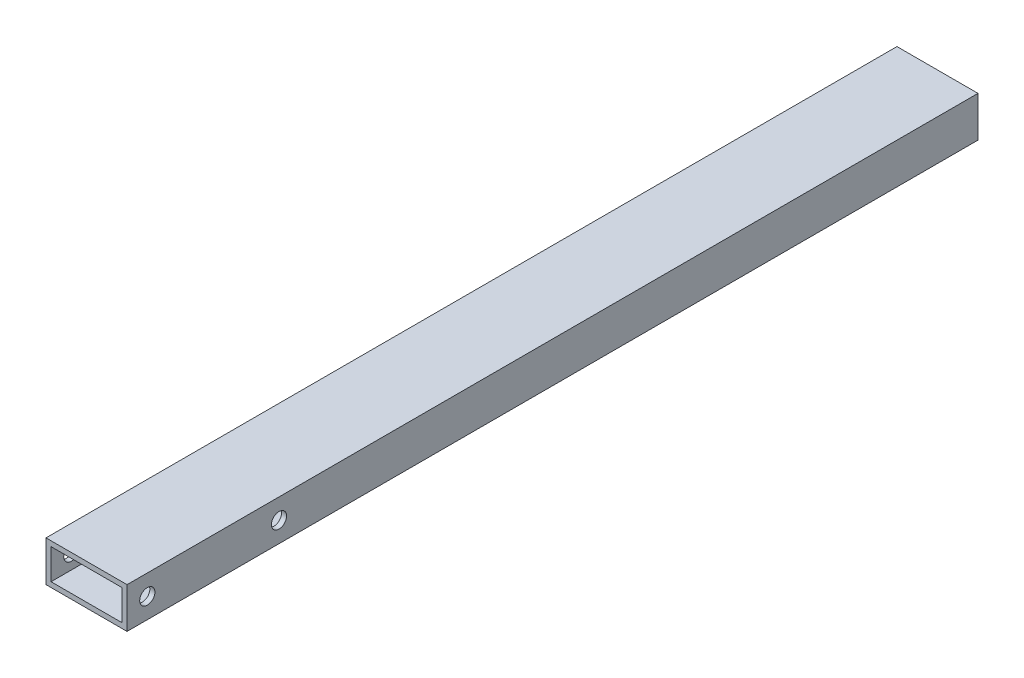
ISO-10303-21;
HEADER;
FILE_DESCRIPTION(('STEP AP214'),'2;1');
FILE_NAME('part.step','',(''),(''),'','','');
FILE_SCHEMA(('AUTOMOTIVE_DESIGN { 1 0 10303 214 1 1 1 1 }'));
ENDSEC;
DATA;
#1=APPLICATION_CONTEXT('core data for automotive mechanical design processes');
#2=APPLICATION_PROTOCOL_DEFINITION('international standard','automotive_design',2000,#1);
#3=PRODUCT_CONTEXT('',#1,'mechanical');
#4=PRODUCT('Part','Part','',(#3));
#5=PRODUCT_RELATED_PRODUCT_CATEGORY('part','',(#4));
#6=PRODUCT_DEFINITION_FORMATION('','',#4);
#7=PRODUCT_DEFINITION_CONTEXT('part definition',#1,'design');
#8=PRODUCT_DEFINITION('design','',#6,#7);
#9=PRODUCT_DEFINITION_SHAPE('','',#8);
#10=(LENGTH_UNIT() NAMED_UNIT(*) SI_UNIT(.MILLI.,.METRE.));
#11=(NAMED_UNIT(*) PLANE_ANGLE_UNIT() SI_UNIT($,.RADIAN.));
#12=(NAMED_UNIT(*) SI_UNIT($,.STERADIAN.) SOLID_ANGLE_UNIT());
#13=UNCERTAINTY_MEASURE_WITH_UNIT(LENGTH_MEASURE(1.E-05),#10,'distance_accuracy_value','');
#14=(GEOMETRIC_REPRESENTATION_CONTEXT(3) GLOBAL_UNCERTAINTY_ASSIGNED_CONTEXT((#13)) GLOBAL_UNIT_ASSIGNED_CONTEXT((#10,
#11,#12)) REPRESENTATION_CONTEXT('',''));
#15=CARTESIAN_POINT('',(0.,0.,0.));
#16=DIRECTION('',(0.,0.,1.));
#17=DIRECTION('',(1.,0.,0.));
#18=AXIS2_PLACEMENT_3D('',#15,#16,#17);
#19=CARTESIAN_POINT('',(0.,0.,0.));
#20=DIRECTION('',(0.,0.,-1.));
#21=DIRECTION('',(-1.,0.,0.));
#22=AXIS2_PLACEMENT_3D('',#19,#20,#21);
#23=PLANE('',#22);
#24=DIRECTION('',(0.,1.,0.));
#25=VECTOR('',#24,1.);
#26=CARTESIAN_POINT('',(25.4,-12.7,0.));
#27=LINE('',#26,#25);
#28=CARTESIAN_POINT('',(25.4,-12.7,0.));
#29=VERTEX_POINT('',#28);
#30=CARTESIAN_POINT('',(25.4,12.7,0.));
#31=VERTEX_POINT('',#30);
#32=EDGE_CURVE('E165',#29,#31,#27,.T.);
#33=ORIENTED_EDGE('',*,*,#32,.F.);
#34=DIRECTION('',(1.,0.,0.));
#35=VECTOR('',#34,1.);
#36=CARTESIAN_POINT('',(-25.4,-12.7,0.));
#37=LINE('',#36,#35);
#38=CARTESIAN_POINT('',(-25.4,-12.7,0.));
#39=VERTEX_POINT('',#38);
#40=EDGE_CURVE('E58',#39,#29,#37,.T.);
#41=ORIENTED_EDGE('',*,*,#40,.F.);
#42=DIRECTION('',(0.,-1.,0.));
#43=VECTOR('',#42,1.);
#44=CARTESIAN_POINT('',(-25.4,-12.7,0.));
#45=LINE('',#44,#43);
#46=CARTESIAN_POINT('',(-25.4,12.7,0.));
#47=VERTEX_POINT('',#46);
#48=EDGE_CURVE('E170',#47,#39,#45,.T.);
#49=ORIENTED_EDGE('',*,*,#48,.F.);
#50=DIRECTION('',(-1.,0.,0.));
#51=VECTOR('',#50,1.);
#52=CARTESIAN_POINT('',(-25.4,12.7,0.));
#53=LINE('',#52,#51);
#54=EDGE_CURVE('E168',#31,#47,#53,.T.);
#55=ORIENTED_EDGE('',*,*,#54,.F.);
#56=EDGE_LOOP('',(#33,#41,#49,#55));
#57=FACE_BOUND('',#56,.T.);
#58=DIRECTION('',(-1.,0.,0.));
#59=VECTOR('',#58,1.);
#60=CARTESIAN_POINT('',(-22.225,9.525,0.));
#61=LINE('',#60,#59);
#62=CARTESIAN_POINT('',(22.225,9.525,0.));
#63=VERTEX_POINT('',#62);
#64=CARTESIAN_POINT('',(-22.225,9.525,0.));
#65=VERTEX_POINT('',#64);
#66=EDGE_CURVE('E158',#63,#65,#61,.T.);
#67=ORIENTED_EDGE('',*,*,#66,.T.);
#68=DIRECTION('',(0.,-1.,0.));
#69=VECTOR('',#68,1.);
#70=CARTESIAN_POINT('',(-22.225,-9.525,0.));
#71=LINE('',#70,#69);
#72=CARTESIAN_POINT('',(-22.225,-9.525,0.));
#73=VERTEX_POINT('',#72);
#74=EDGE_CURVE('E50',#65,#73,#71,.T.);
#75=ORIENTED_EDGE('',*,*,#74,.T.);
#76=DIRECTION('',(1.,0.,0.));
#77=VECTOR('',#76,1.);
#78=CARTESIAN_POINT('',(-22.225,-9.525,0.));
#79=LINE('',#78,#77);
#80=CARTESIAN_POINT('',(22.225,-9.525,0.));
#81=VERTEX_POINT('',#80);
#82=EDGE_CURVE('E155',#73,#81,#79,.T.);
#83=ORIENTED_EDGE('',*,*,#82,.T.);
#84=DIRECTION('',(0.,1.,0.));
#85=VECTOR('',#84,1.);
#86=CARTESIAN_POINT('',(22.225,-9.525,0.));
#87=LINE('',#86,#85);
#88=EDGE_CURVE('E109',#81,#63,#87,.T.);
#89=ORIENTED_EDGE('',*,*,#88,.T.);
#90=EDGE_LOOP('',(#67,#75,#83,#89));
#91=FACE_BOUND('',#90,.T.);
#92=ADVANCED_FACE('F33',(#57,#91),#23,.T.);
#93=CARTESIAN_POINT('',(25.4,-12.7,457.2));
#94=DIRECTION('',(-1.,0.,0.));
#95=DIRECTION('',(0.,0.,1.));
#96=AXIS2_PLACEMENT_3D('',#93,#94,#95);
#97=PLANE('',#96);
#98=CARTESIAN_POINT('',(25.4,0.,520.7));
#99=DIRECTION('',(-1.,0.,0.));
#100=DIRECTION('',(0.,0.,1.));
#101=AXIS2_PLACEMENT_3D('',#98,#99,#100);
#102=CIRCLE('',#101,4.76250000000001);
#103=CARTESIAN_POINT('',(25.4,0.,525.4625));
#104=VERTEX_POINT('',#103);
#105=EDGE_CURVE('E342',#104,#104,#102,.T.);
#106=ORIENTED_EDGE('',*,*,#105,.T.);
#107=EDGE_LOOP('',(#106));
#108=FACE_BOUND('',#107,.T.);
#109=CARTESIAN_POINT('',(25.4,0.,438.15));
#110=DIRECTION('',(-1.,0.,0.));
#111=DIRECTION('',(0.,0.,1.));
#112=AXIS2_PLACEMENT_3D('',#109,#110,#111);
#113=CIRCLE('',#112,4.76250000000001);
#114=CARTESIAN_POINT('',(25.4,0.,442.9125));
#115=VERTEX_POINT('',#114);
#116=EDGE_CURVE('E145',#115,#115,#113,.T.);
#117=ORIENTED_EDGE('',*,*,#116,.T.);
#118=EDGE_LOOP('',(#117));
#119=FACE_BOUND('',#118,.T.);
#120=ORIENTED_EDGE('',*,*,#32,.T.);
#121=DIRECTION('',(0.,0.,-1.));
#122=VECTOR('',#121,1.);
#123=CARTESIAN_POINT('',(25.4,12.7,457.2));
#124=LINE('',#123,#122);
#125=CARTESIAN_POINT('',(25.4,12.7,533.4));
#126=VERTEX_POINT('',#125);
#127=EDGE_CURVE('E11',#126,#31,#124,.T.);
#128=ORIENTED_EDGE('',*,*,#127,.F.);
#129=DIRECTION('',(0.,1.,0.));
#130=VECTOR('',#129,1.);
#131=CARTESIAN_POINT('',(25.4,-12.7,533.4));
#132=LINE('',#131,#130);
#133=CARTESIAN_POINT('',(25.4,-12.7,533.4));
#134=VERTEX_POINT('',#133);
#135=EDGE_CURVE('E135',#134,#126,#132,.T.);
#136=ORIENTED_EDGE('',*,*,#135,.F.);
#137=DIRECTION('',(0.,0.,-1.));
#138=VECTOR('',#137,1.);
#139=CARTESIAN_POINT('',(25.4,-12.7,457.2));
#140=LINE('',#139,#138);
#141=EDGE_CURVE('E173',#134,#29,#140,.T.);
#142=ORIENTED_EDGE('',*,*,#141,.T.);
#143=EDGE_LOOP('',(#120,#128,#136,#142));
#144=FACE_BOUND('',#143,.T.);
#145=ADVANCED_FACE('F35',(#108,#119,#144),#97,.F.);
#146=CARTESIAN_POINT('',(-25.4,12.7,457.2));
#147=DIRECTION('',(0.,-1.,0.));
#148=DIRECTION('',(0.,0.,-1.));
#149=AXIS2_PLACEMENT_3D('',#146,#147,#148);
#150=PLANE('',#149);
#151=ORIENTED_EDGE('',*,*,#54,.T.);
#152=DIRECTION('',(0.,0.,-1.));
#153=VECTOR('',#152,1.);
#154=CARTESIAN_POINT('',(-25.4,12.7,457.2));
#155=LINE('',#154,#153);
#156=CARTESIAN_POINT('',(-25.4,12.7,533.4));
#157=VERTEX_POINT('',#156);
#158=EDGE_CURVE('E42',#157,#47,#155,.T.);
#159=ORIENTED_EDGE('',*,*,#158,.F.);
#160=DIRECTION('',(-1.,0.,0.));
#161=VECTOR('',#160,1.);
#162=CARTESIAN_POINT('',(25.4,12.7,533.4));
#163=LINE('',#162,#161);
#164=EDGE_CURVE('E138',#126,#157,#163,.T.);
#165=ORIENTED_EDGE('',*,*,#164,.F.);
#166=ORIENTED_EDGE('',*,*,#127,.T.);
#167=EDGE_LOOP('',(#151,#159,#165,#166));
#168=FACE_BOUND('',#167,.T.);
#169=ADVANCED_FACE('F206',(#168),#150,.F.);
#170=CARTESIAN_POINT('',(-25.4,-12.7,457.2));
#171=DIRECTION('',(1.,0.,0.));
#172=DIRECTION('',(0.,0.,-1.));
#173=AXIS2_PLACEMENT_3D('',#170,#171,#172);
#174=PLANE('',#173);
#175=CARTESIAN_POINT('',(-25.4,0.,520.7));
#176=DIRECTION('',(-1.,0.,0.));
#177=DIRECTION('',(0.,0.,1.));
#178=AXIS2_PLACEMENT_3D('',#175,#176,#177);
#179=CIRCLE('',#178,4.76250000000001);
#180=CARTESIAN_POINT('',(-25.4,0.,525.4625));
#181=VERTEX_POINT('',#180);
#182=EDGE_CURVE('E344',#181,#181,#179,.T.);
#183=ORIENTED_EDGE('',*,*,#182,.F.);
#184=EDGE_LOOP('',(#183));
#185=FACE_BOUND('',#184,.T.);
#186=CARTESIAN_POINT('',(-25.4,0.,438.15));
#187=DIRECTION('',(-1.,0.,0.));
#188=DIRECTION('',(0.,0.,1.));
#189=AXIS2_PLACEMENT_3D('',#186,#187,#188);
#190=CIRCLE('',#189,4.76250000000001);
#191=CARTESIAN_POINT('',(-25.4,0.,442.9125));
#192=VERTEX_POINT('',#191);
#193=EDGE_CURVE('E144',#192,#192,#190,.T.);
#194=ORIENTED_EDGE('',*,*,#193,.F.);
#195=EDGE_LOOP('',(#194));
#196=FACE_BOUND('',#195,.T.);
#197=ORIENTED_EDGE('',*,*,#48,.T.);
#198=DIRECTION('',(0.,0.,-1.));
#199=VECTOR('',#198,1.);
#200=CARTESIAN_POINT('',(-25.4,-12.7,457.2));
#201=LINE('',#200,#199);
#202=CARTESIAN_POINT('',(-25.4,-12.7,533.4));
#203=VERTEX_POINT('',#202);
#204=EDGE_CURVE('E175',#203,#39,#201,.T.);
#205=ORIENTED_EDGE('',*,*,#204,.F.);
#206=DIRECTION('',(0.,-1.,0.));
#207=VECTOR('',#206,1.);
#208=CARTESIAN_POINT('',(-25.4,12.7,533.4));
#209=LINE('',#208,#207);
#210=EDGE_CURVE('E141',#157,#203,#209,.T.);
#211=ORIENTED_EDGE('',*,*,#210,.F.);
#212=ORIENTED_EDGE('',*,*,#158,.T.);
#213=EDGE_LOOP('',(#197,#205,#211,#212));
#214=FACE_BOUND('',#213,.T.);
#215=ADVANCED_FACE('F215',(#185,#196,#214),#174,.F.);
#216=CARTESIAN_POINT('',(-25.4,-12.7,457.2));
#217=DIRECTION('',(0.,1.,0.));
#218=DIRECTION('',(-1.,0.,0.));
#219=AXIS2_PLACEMENT_3D('',#216,#217,#218);
#220=PLANE('',#219);
#221=ORIENTED_EDGE('',*,*,#40,.T.);
#222=ORIENTED_EDGE('',*,*,#141,.F.);
#223=DIRECTION('',(1.,0.,0.));
#224=VECTOR('',#223,1.);
#225=CARTESIAN_POINT('',(-25.4,-12.7,533.4));
#226=LINE('',#225,#224);
#227=EDGE_CURVE('E132',#203,#134,#226,.T.);
#228=ORIENTED_EDGE('',*,*,#227,.F.);
#229=ORIENTED_EDGE('',*,*,#204,.T.);
#230=EDGE_LOOP('',(#221,#222,#228,#229));
#231=FACE_BOUND('',#230,.T.);
#232=ADVANCED_FACE('F212',(#231),#220,.F.);
#233=CARTESIAN_POINT('',(-22.225,-9.525,457.2));
#234=DIRECTION('',(1.,0.,0.));
#235=DIRECTION('',(0.,0.,-1.));
#236=AXIS2_PLACEMENT_3D('',#233,#234,#235);
#237=PLANE('',#236);
#238=CARTESIAN_POINT('',(-22.225,0.,520.7));
#239=DIRECTION('',(1.,0.,0.));
#240=DIRECTION('',(0.,0.,-1.));
#241=AXIS2_PLACEMENT_3D('',#238,#239,#240);
#242=CIRCLE('',#241,4.76250000000001);
#243=CARTESIAN_POINT('',(-22.225,0.,515.9375));
#244=VERTEX_POINT('',#243);
#245=EDGE_CURVE('E121',#244,#244,#242,.T.);
#246=ORIENTED_EDGE('',*,*,#245,.F.);
#247=EDGE_LOOP('',(#246));
#248=FACE_BOUND('',#247,.T.);
#249=CARTESIAN_POINT('',(-22.225,0.,438.15));
#250=DIRECTION('',(1.,0.,0.));
#251=DIRECTION('',(0.,0.,-1.));
#252=AXIS2_PLACEMENT_3D('',#249,#250,#251);
#253=CIRCLE('',#252,4.76250000000001);
#254=CARTESIAN_POINT('',(-22.225,0.,433.3875));
#255=VERTEX_POINT('',#254);
#256=EDGE_CURVE('E151',#255,#255,#253,.T.);
#257=ORIENTED_EDGE('',*,*,#256,.F.);
#258=EDGE_LOOP('',(#257));
#259=FACE_BOUND('',#258,.T.);
#260=ORIENTED_EDGE('',*,*,#74,.F.);
#261=DIRECTION('',(0.,0.,-1.));
#262=VECTOR('',#261,1.);
#263=CARTESIAN_POINT('',(-22.225,9.525,457.2));
#264=LINE('',#263,#262);
#265=CARTESIAN_POINT('',(-22.225,9.525,533.4));
#266=VERTEX_POINT('',#265);
#267=EDGE_CURVE('E161',#266,#65,#264,.T.);
#268=ORIENTED_EDGE('',*,*,#267,.F.);
#269=DIRECTION('',(0.,-1.,0.));
#270=VECTOR('',#269,1.);
#271=CARTESIAN_POINT('',(-22.225,9.525,533.4));
#272=LINE('',#271,#270);
#273=CARTESIAN_POINT('',(-22.225,-9.525,533.4));
#274=VERTEX_POINT('',#273);
#275=EDGE_CURVE('E127',#266,#274,#272,.T.);
#276=ORIENTED_EDGE('',*,*,#275,.T.);
#277=DIRECTION('',(0.,0.,-1.));
#278=VECTOR('',#277,1.);
#279=CARTESIAN_POINT('',(-22.225,-9.525,457.2));
#280=LINE('',#279,#278);
#281=EDGE_CURVE('E112',#274,#73,#280,.T.);
#282=ORIENTED_EDGE('',*,*,#281,.T.);
#283=EDGE_LOOP('',(#260,#268,#276,#282));
#284=FACE_BOUND('',#283,.T.);
#285=ADVANCED_FACE('F196',(#248,#259,#284),#237,.T.);
#286=CARTESIAN_POINT('',(-22.225,-9.525,457.2));
#287=DIRECTION('',(0.,1.,0.));
#288=DIRECTION('',(0.,0.,1.));
#289=AXIS2_PLACEMENT_3D('',#286,#287,#288);
#290=PLANE('',#289);
#291=ORIENTED_EDGE('',*,*,#82,.F.);
#292=ORIENTED_EDGE('',*,*,#281,.F.);
#293=DIRECTION('',(1.,0.,0.));
#294=VECTOR('',#293,1.);
#295=CARTESIAN_POINT('',(-22.225,-9.525,533.4));
#296=LINE('',#295,#294);
#297=CARTESIAN_POINT('',(22.225,-9.525,533.4));
#298=VERTEX_POINT('',#297);
#299=EDGE_CURVE('E116',#274,#298,#296,.T.);
#300=ORIENTED_EDGE('',*,*,#299,.T.);
#301=DIRECTION('',(0.,0.,-1.));
#302=VECTOR('',#301,1.);
#303=CARTESIAN_POINT('',(22.225,-9.525,457.2));
#304=LINE('',#303,#302);
#305=EDGE_CURVE('E102',#298,#81,#304,.T.);
#306=ORIENTED_EDGE('',*,*,#305,.T.);
#307=EDGE_LOOP('',(#291,#292,#300,#306));
#308=FACE_BOUND('',#307,.T.);
#309=ADVANCED_FACE('F117',(#308),#290,.T.);
#310=CARTESIAN_POINT('',(22.225,-9.525,457.2));
#311=DIRECTION('',(-1.,0.,0.));
#312=DIRECTION('',(0.,-1.,0.));
#313=AXIS2_PLACEMENT_3D('',#310,#311,#312);
#314=PLANE('',#313);
#315=CARTESIAN_POINT('',(22.225,0.,520.7));
#316=DIRECTION('',(-1.,0.,0.));
#317=DIRECTION('',(0.,-1.,0.));
#318=AXIS2_PLACEMENT_3D('',#315,#316,#317);
#319=CIRCLE('',#318,4.76250000000001);
#320=CARTESIAN_POINT('',(22.225,-4.76250000000001,520.7));
#321=VERTEX_POINT('',#320);
#322=EDGE_CURVE('E37',#321,#321,#319,.T.);
#323=ORIENTED_EDGE('',*,*,#322,.F.);
#324=EDGE_LOOP('',(#323));
#325=FACE_BOUND('',#324,.T.);
#326=CARTESIAN_POINT('',(22.225,0.,438.15));
#327=DIRECTION('',(-1.,0.,0.));
#328=DIRECTION('',(0.,-1.,0.));
#329=AXIS2_PLACEMENT_3D('',#326,#327,#328);
#330=CIRCLE('',#329,4.76250000000001);
#331=CARTESIAN_POINT('',(22.225,-4.76250000000002,438.15));
#332=VERTEX_POINT('',#331);
#333=EDGE_CURVE('E148',#332,#332,#330,.T.);
#334=ORIENTED_EDGE('',*,*,#333,.F.);
#335=EDGE_LOOP('',(#334));
#336=FACE_BOUND('',#335,.T.);
#337=ORIENTED_EDGE('',*,*,#88,.F.);
#338=ORIENTED_EDGE('',*,*,#305,.F.);
#339=DIRECTION('',(0.,1.,0.));
#340=VECTOR('',#339,1.);
#341=CARTESIAN_POINT('',(22.225,-9.525,533.4));
#342=LINE('',#341,#340);
#343=CARTESIAN_POINT('',(22.225,9.525,533.4));
#344=VERTEX_POINT('',#343);
#345=EDGE_CURVE('E106',#298,#344,#342,.T.);
#346=ORIENTED_EDGE('',*,*,#345,.T.);
#347=DIRECTION('',(0.,0.,-1.));
#348=VECTOR('',#347,1.);
#349=CARTESIAN_POINT('',(22.225,9.525,457.2));
#350=LINE('',#349,#348);
#351=EDGE_CURVE('E113',#344,#63,#350,.T.);
#352=ORIENTED_EDGE('',*,*,#351,.T.);
#353=EDGE_LOOP('',(#337,#338,#346,#352));
#354=FACE_BOUND('',#353,.T.);
#355=ADVANCED_FACE('F104',(#325,#336,#354),#314,.T.);
#356=CARTESIAN_POINT('',(-22.225,9.525,457.2));
#357=DIRECTION('',(0.,-1.,0.));
#358=DIRECTION('',(1.,0.,0.));
#359=AXIS2_PLACEMENT_3D('',#356,#357,#358);
#360=PLANE('',#359);
#361=ORIENTED_EDGE('',*,*,#66,.F.);
#362=ORIENTED_EDGE('',*,*,#351,.F.);
#363=DIRECTION('',(-1.,0.,0.));
#364=VECTOR('',#363,1.);
#365=CARTESIAN_POINT('',(22.225,9.525,533.4));
#366=LINE('',#365,#364);
#367=EDGE_CURVE('E125',#344,#266,#366,.T.);
#368=ORIENTED_EDGE('',*,*,#367,.T.);
#369=ORIENTED_EDGE('',*,*,#267,.T.);
#370=EDGE_LOOP('',(#361,#362,#368,#369));
#371=FACE_BOUND('',#370,.T.);
#372=ADVANCED_FACE('F185',(#371),#360,.T.);
#373=CARTESIAN_POINT('',(25.4,0.,438.15));
#374=DIRECTION('',(-1.,0.,0.));
#375=DIRECTION('',(0.,0.,1.));
#376=AXIS2_PLACEMENT_3D('',#373,#374,#375);
#377=CYLINDRICAL_SURFACE('',#376,4.76250000000001);
#378=ORIENTED_EDGE('',*,*,#333,.T.);
#379=EDGE_LOOP('',(#378));
#380=FACE_BOUND('',#379,.T.);
#381=ORIENTED_EDGE('',*,*,#116,.F.);
#382=EDGE_LOOP('',(#381));
#383=FACE_BOUND('',#382,.T.);
#384=ADVANCED_FACE('F181',(#380,#383),#377,.F.);
#385=ORIENTED_EDGE('',*,*,#256,.T.);
#386=EDGE_LOOP('',(#385));
#387=FACE_BOUND('',#386,.T.);
#388=ORIENTED_EDGE('',*,*,#193,.T.);
#389=EDGE_LOOP('',(#388));
#390=FACE_BOUND('',#389,.T.);
#391=ADVANCED_FACE('F233',(#387,#390),#377,.F.);
#392=CARTESIAN_POINT('',(0.,0.,533.4));
#393=DIRECTION('',(0.,0.,1.));
#394=DIRECTION('',(1.,0.,0.));
#395=AXIS2_PLACEMENT_3D('',#392,#393,#394);
#396=PLANE('',#395);
#397=ORIENTED_EDGE('',*,*,#227,.T.);
#398=ORIENTED_EDGE('',*,*,#135,.T.);
#399=ORIENTED_EDGE('',*,*,#164,.T.);
#400=ORIENTED_EDGE('',*,*,#210,.T.);
#401=EDGE_LOOP('',(#397,#398,#399,#400));
#402=FACE_BOUND('',#401,.T.);
#403=ORIENTED_EDGE('',*,*,#345,.F.);
#404=ORIENTED_EDGE('',*,*,#299,.F.);
#405=ORIENTED_EDGE('',*,*,#275,.F.);
#406=ORIENTED_EDGE('',*,*,#367,.F.);
#407=EDGE_LOOP('',(#403,#404,#405,#406));
#408=FACE_BOUND('',#407,.T.);
#409=ADVANCED_FACE('F123',(#402,#408),#396,.T.);
#410=CARTESIAN_POINT('',(25.4,0.,520.7));
#411=DIRECTION('',(-1.,0.,0.));
#412=DIRECTION('',(0.,0.,1.));
#413=AXIS2_PLACEMENT_3D('',#410,#411,#412);
#414=CYLINDRICAL_SURFACE('',#413,4.76250000000001);
#415=ORIENTED_EDGE('',*,*,#322,.T.);
#416=EDGE_LOOP('',(#415));
#417=FACE_BOUND('',#416,.T.);
#418=ORIENTED_EDGE('',*,*,#105,.F.);
#419=EDGE_LOOP('',(#418));
#420=FACE_BOUND('',#419,.T.);
#421=ADVANCED_FACE('F232',(#417,#420),#414,.F.);
#422=ORIENTED_EDGE('',*,*,#245,.T.);
#423=EDGE_LOOP('',(#422));
#424=FACE_BOUND('',#423,.T.);
#425=ORIENTED_EDGE('',*,*,#182,.T.);
#426=EDGE_LOOP('',(#425));
#427=FACE_BOUND('',#426,.T.);
#428=ADVANCED_FACE('F239',(#424,#427),#414,.F.);
#429=CLOSED_SHELL('',(#92,#145,#169,#215,#232,#285,#309,#355,#372,#384,#391,#409,#421,#428));
#430=MANIFOLD_SOLID_BREP('B2',#429);
#431=ADVANCED_BREP_SHAPE_REPRESENTATION('',(#18,#430),#14);
#432=SHAPE_DEFINITION_REPRESENTATION(#9,#431);
ENDSEC;
END-ISO-10303-21;
